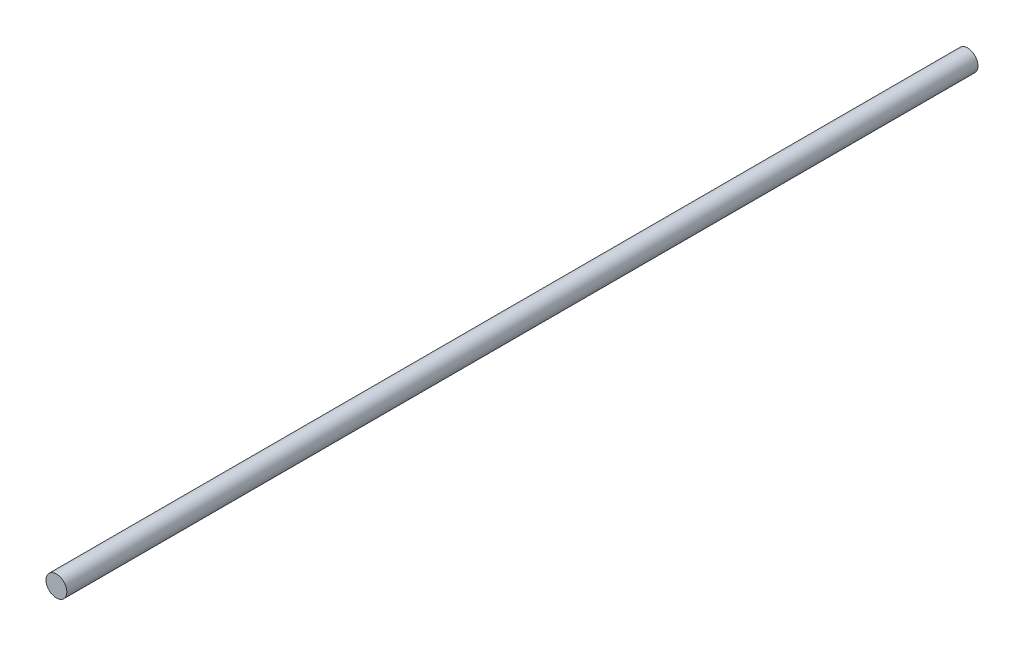
ISO-10303-21;
HEADER;
FILE_DESCRIPTION(('STEP AP214'),'2;1');
FILE_NAME('part.step','',(''),(''),'','','');
FILE_SCHEMA(('AUTOMOTIVE_DESIGN { 1 0 10303 214 1 1 1 1 }'));
ENDSEC;
DATA;
#1=APPLICATION_CONTEXT('core data for automotive mechanical design processes');
#2=APPLICATION_PROTOCOL_DEFINITION('international standard','automotive_design',2000,#1);
#3=PRODUCT_CONTEXT('',#1,'mechanical');
#4=PRODUCT('Part','Part','',(#3));
#5=PRODUCT_RELATED_PRODUCT_CATEGORY('part','',(#4));
#6=PRODUCT_DEFINITION_FORMATION('','',#4);
#7=PRODUCT_DEFINITION_CONTEXT('part definition',#1,'design');
#8=PRODUCT_DEFINITION('design','',#6,#7);
#9=PRODUCT_DEFINITION_SHAPE('','',#8);
#10=(LENGTH_UNIT() NAMED_UNIT(*) SI_UNIT(.MILLI.,.METRE.));
#11=(NAMED_UNIT(*) PLANE_ANGLE_UNIT() SI_UNIT($,.RADIAN.));
#12=(NAMED_UNIT(*) SI_UNIT($,.STERADIAN.) SOLID_ANGLE_UNIT());
#13=UNCERTAINTY_MEASURE_WITH_UNIT(LENGTH_MEASURE(1.E-05),#10,'distance_accuracy_value','');
#14=(GEOMETRIC_REPRESENTATION_CONTEXT(3) GLOBAL_UNCERTAINTY_ASSIGNED_CONTEXT((#13)) GLOBAL_UNIT_ASSIGNED_CONTEXT((#10,
#11,#12)) REPRESENTATION_CONTEXT('',''));
#15=CARTESIAN_POINT('',(0.,0.,0.));
#16=DIRECTION('',(0.,0.,1.));
#17=DIRECTION('',(1.,0.,0.));
#18=AXIS2_PLACEMENT_3D('',#15,#16,#17);
#19=CARTESIAN_POINT('',(0.,0.,700.));
#20=DIRECTION('',(0.,0.,-1.));
#21=DIRECTION('',(-1.,0.,0.));
#22=AXIS2_PLACEMENT_3D('',#19,#20,#21);
#23=CYLINDRICAL_SURFACE('',#22,8.);
#24=CARTESIAN_POINT('',(0.,0.,700.));
#25=DIRECTION('',(0.,0.,1.));
#26=DIRECTION('',(1.,0.,0.));
#27=AXIS2_PLACEMENT_3D('',#24,#25,#26);
#28=CIRCLE('',#27,8.);
#29=CARTESIAN_POINT('',(8.,0.,700.));
#30=VERTEX_POINT('',#29);
#31=EDGE_CURVE('E10',#30,#30,#28,.T.);
#32=ORIENTED_EDGE('',*,*,#31,.F.);
#33=EDGE_LOOP('',(#32));
#34=FACE_BOUND('',#33,.T.);
#35=CARTESIAN_POINT('',(0.,0.,0.));
#36=DIRECTION('',(0.,0.,1.));
#37=DIRECTION('',(1.,0.,0.));
#38=AXIS2_PLACEMENT_3D('',#35,#36,#37);
#39=CIRCLE('',#38,8.);
#40=CARTESIAN_POINT('',(8.,0.,0.));
#41=VERTEX_POINT('',#40);
#42=EDGE_CURVE('E37',#41,#41,#39,.T.);
#43=ORIENTED_EDGE('',*,*,#42,.T.);
#44=EDGE_LOOP('',(#43));
#45=FACE_BOUND('',#44,.T.);
#46=ADVANCED_FACE('F34',(#34,#45),#23,.T.);
#47=CARTESIAN_POINT('',(0.,0.,700.));
#48=DIRECTION('',(0.,0.,1.));
#49=DIRECTION('',(1.,0.,0.));
#50=AXIS2_PLACEMENT_3D('',#47,#48,#49);
#51=PLANE('',#50);
#52=ORIENTED_EDGE('',*,*,#31,.T.);
#53=EDGE_LOOP('',(#52));
#54=FACE_BOUND('',#53,.T.);
#55=ADVANCED_FACE('F49',(#54),#51,.T.);
#56=CARTESIAN_POINT('',(0.,0.,0.));
#57=DIRECTION('',(0.,0.,1.));
#58=DIRECTION('',(1.,0.,0.));
#59=AXIS2_PLACEMENT_3D('',#56,#57,#58);
#60=PLANE('',#59);
#61=ORIENTED_EDGE('',*,*,#42,.F.);
#62=EDGE_LOOP('',(#61));
#63=FACE_BOUND('',#62,.T.);
#64=ADVANCED_FACE('F47',(#63),#60,.F.);
#65=CLOSED_SHELL('',(#46,#55,#64));
#66=MANIFOLD_SOLID_BREP('B2',#65);
#67=ADVANCED_BREP_SHAPE_REPRESENTATION('',(#18,#66),#14);
#68=SHAPE_DEFINITION_REPRESENTATION(#9,#67);
ENDSEC;
END-ISO-10303-21;
